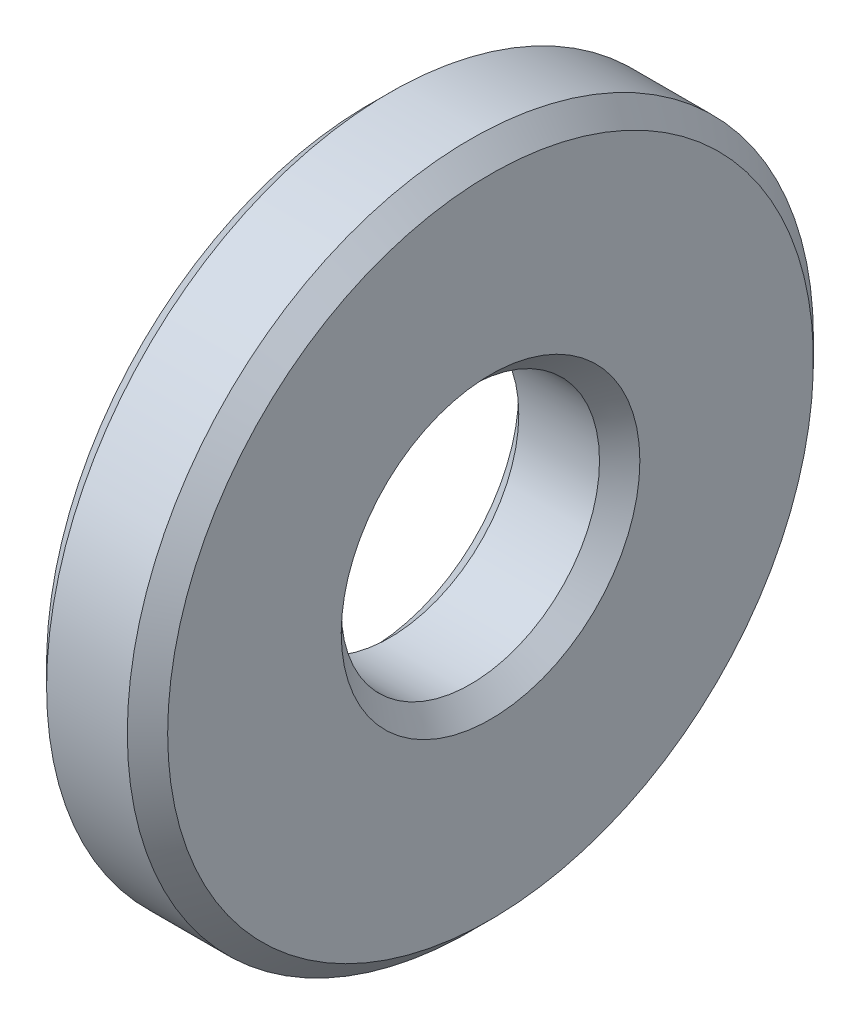
ISO-10303-21;
HEADER;
FILE_DESCRIPTION(('STEP AP214'),'2;1');
FILE_NAME('part.step','',(''),(''),'','','');
FILE_SCHEMA(('AUTOMOTIVE_DESIGN { 1 0 10303 214 1 1 1 1 }'));
ENDSEC;
DATA;
#1=APPLICATION_CONTEXT('core data for automotive mechanical design processes');
#2=APPLICATION_PROTOCOL_DEFINITION('international standard','automotive_design',2000,#1);
#3=PRODUCT_CONTEXT('',#1,'mechanical');
#4=PRODUCT('Part','Part','',(#3));
#5=PRODUCT_RELATED_PRODUCT_CATEGORY('part','',(#4));
#6=PRODUCT_DEFINITION_FORMATION('','',#4);
#7=PRODUCT_DEFINITION_CONTEXT('part definition',#1,'design');
#8=PRODUCT_DEFINITION('design','',#6,#7);
#9=PRODUCT_DEFINITION_SHAPE('','',#8);
#10=(LENGTH_UNIT() NAMED_UNIT(*) SI_UNIT(.MILLI.,.METRE.));
#11=(NAMED_UNIT(*) PLANE_ANGLE_UNIT() SI_UNIT($,.RADIAN.));
#12=(NAMED_UNIT(*) SI_UNIT($,.STERADIAN.) SOLID_ANGLE_UNIT());
#13=UNCERTAINTY_MEASURE_WITH_UNIT(LENGTH_MEASURE(1.E-05),#10,'distance_accuracy_value','');
#14=(GEOMETRIC_REPRESENTATION_CONTEXT(3) GLOBAL_UNCERTAINTY_ASSIGNED_CONTEXT((#13)) GLOBAL_UNIT_ASSIGNED_CONTEXT((#10,
#11,#12)) REPRESENTATION_CONTEXT('',''));
#15=CARTESIAN_POINT('',(0.,0.,0.));
#16=DIRECTION('',(0.,0.,1.));
#17=DIRECTION('',(1.,0.,0.));
#18=AXIS2_PLACEMENT_3D('',#15,#16,#17);
#19=CARTESIAN_POINT('',(0.,3.2,0.));
#20=DIRECTION('',(1.,0.,0.));
#21=DIRECTION('',(0.,0.,-1.));
#22=AXIS2_PLACEMENT_3D('',#19,#20,#21);
#23=PLANE('',#22);
#24=CARTESIAN_POINT('',(0.,0.,0.));
#25=DIRECTION('',(1.,0.,0.));
#26=DIRECTION('',(0.,0.,-1.));
#27=AXIS2_PLACEMENT_3D('',#24,#25,#26);
#28=CIRCLE('',#27,8.);
#29=CARTESIAN_POINT('',(0.,0.,-8.));
#30=VERTEX_POINT('',#29);
#31=EDGE_CURVE('E40',#30,#30,#28,.F.);
#32=ORIENTED_EDGE('',*,*,#31,.T.);
#33=EDGE_LOOP('',(#32));
#34=FACE_BOUND('',#33,.T.);
#35=CARTESIAN_POINT('',(0.,0.,0.));
#36=DIRECTION('',(1.,0.,0.));
#37=DIRECTION('',(0.,0.,-1.));
#38=AXIS2_PLACEMENT_3D('',#35,#36,#37);
#39=CIRCLE('',#38,3.7);
#40=CARTESIAN_POINT('',(0.,0.,-3.7));
#41=VERTEX_POINT('',#40);
#42=EDGE_CURVE('E44',#41,#41,#39,.T.);
#43=ORIENTED_EDGE('',*,*,#42,.T.);
#44=EDGE_LOOP('',(#43));
#45=FACE_BOUND('',#44,.T.);
#46=ADVANCED_FACE('F30',(#34,#45),#23,.F.);
#47=CARTESIAN_POINT('',(0.,0.,0.));
#48=DIRECTION('',(-1.,0.,0.));
#49=DIRECTION('',(0.,0.,1.));
#50=AXIS2_PLACEMENT_3D('',#47,#48,#49);
#51=CYLINDRICAL_SURFACE('',#50,8.5);
#52=CARTESIAN_POINT('',(2.49999999999999,0.,0.));
#53=DIRECTION('',(-1.,0.,0.));
#54=DIRECTION('',(0.,0.,1.));
#55=AXIS2_PLACEMENT_3D('',#52,#53,#54);
#56=CIRCLE('',#55,8.5);
#57=CARTESIAN_POINT('',(2.49999999999999,0.,8.5));
#58=VERTEX_POINT('',#57);
#59=EDGE_CURVE('E55',#58,#58,#56,.T.);
#60=ORIENTED_EDGE('',*,*,#59,.T.);
#61=EDGE_LOOP('',(#60));
#62=FACE_BOUND('',#61,.T.);
#63=CARTESIAN_POINT('',(0.500000000000009,0.,0.));
#64=DIRECTION('',(1.,0.,0.));
#65=DIRECTION('',(0.,0.,-1.));
#66=AXIS2_PLACEMENT_3D('',#63,#64,#65);
#67=CIRCLE('',#66,8.5);
#68=CARTESIAN_POINT('',(0.500000000000009,0.,-8.5));
#69=VERTEX_POINT('',#68);
#70=EDGE_CURVE('E58',#69,#69,#67,.T.);
#71=ORIENTED_EDGE('',*,*,#70,.T.);
#72=EDGE_LOOP('',(#71));
#73=FACE_BOUND('',#72,.T.);
#74=ADVANCED_FACE('F62',(#62,#73),#51,.T.);
#75=CARTESIAN_POINT('',(3.,3.2,0.));
#76=DIRECTION('',(-1.,0.,0.));
#77=DIRECTION('',(0.,0.,1.));
#78=AXIS2_PLACEMENT_3D('',#75,#76,#77);
#79=PLANE('',#78);
#80=CARTESIAN_POINT('',(3.,0.,0.));
#81=DIRECTION('',(-1.,0.,0.));
#82=DIRECTION('',(0.,0.,1.));
#83=AXIS2_PLACEMENT_3D('',#80,#81,#82);
#84=CIRCLE('',#83,8.);
#85=CARTESIAN_POINT('',(3.,0.,8.));
#86=VERTEX_POINT('',#85);
#87=EDGE_CURVE('E49',#86,#86,#84,.F.);
#88=ORIENTED_EDGE('',*,*,#87,.T.);
#89=EDGE_LOOP('',(#88));
#90=FACE_BOUND('',#89,.T.);
#91=CARTESIAN_POINT('',(3.,0.,0.));
#92=DIRECTION('',(-1.,0.,0.));
#93=DIRECTION('',(0.,0.,1.));
#94=AXIS2_PLACEMENT_3D('',#91,#92,#93);
#95=CIRCLE('',#94,3.7);
#96=CARTESIAN_POINT('',(3.,0.,3.7));
#97=VERTEX_POINT('',#96);
#98=EDGE_CURVE('E52',#97,#97,#95,.T.);
#99=ORIENTED_EDGE('',*,*,#98,.T.);
#100=EDGE_LOOP('',(#99));
#101=FACE_BOUND('',#100,.T.);
#102=ADVANCED_FACE('F92',(#90,#101),#79,.F.);
#103=CARTESIAN_POINT('',(0.,0.,0.));
#104=DIRECTION('',(-1.,0.,0.));
#105=DIRECTION('',(0.,0.,1.));
#106=AXIS2_PLACEMENT_3D('',#103,#104,#105);
#107=CYLINDRICAL_SURFACE('',#106,3.2);
#108=CARTESIAN_POINT('',(2.49999999999999,0.,0.));
#109=DIRECTION('',(-1.,0.,0.));
#110=DIRECTION('',(0.,0.,1.));
#111=AXIS2_PLACEMENT_3D('',#108,#109,#110);
#112=CIRCLE('',#111,3.2);
#113=CARTESIAN_POINT('',(2.49999999999999,0.,3.2));
#114=VERTEX_POINT('',#113);
#115=EDGE_CURVE('E10',#114,#114,#112,.F.);
#116=ORIENTED_EDGE('',*,*,#115,.T.);
#117=EDGE_LOOP('',(#116));
#118=FACE_BOUND('',#117,.T.);
#119=CARTESIAN_POINT('',(0.500000000000009,0.,0.));
#120=DIRECTION('',(1.,0.,0.));
#121=DIRECTION('',(0.,0.,-1.));
#122=AXIS2_PLACEMENT_3D('',#119,#120,#121);
#123=CIRCLE('',#122,3.2);
#124=CARTESIAN_POINT('',(0.500000000000009,0.,-3.2));
#125=VERTEX_POINT('',#124);
#126=EDGE_CURVE('E36',#125,#125,#123,.F.);
#127=ORIENTED_EDGE('',*,*,#126,.T.);
#128=EDGE_LOOP('',(#127));
#129=FACE_BOUND('',#128,.T.);
#130=ADVANCED_FACE('F88',(#118,#129),#107,.F.);
#131=CARTESIAN_POINT('',(2.49999999999999,0.,0.));
#132=DIRECTION('',(-1.,0.,0.));
#133=DIRECTION('',(0.,0.,1.));
#134=AXIS2_PLACEMENT_3D('',#131,#132,#133);
#135=CONICAL_SURFACE('',#134,8.5,0.785398163397444);
#136=ORIENTED_EDGE('',*,*,#87,.F.);
#137=EDGE_LOOP('',(#136));
#138=FACE_BOUND('',#137,.T.);
#139=ORIENTED_EDGE('',*,*,#59,.F.);
#140=EDGE_LOOP('',(#139));
#141=FACE_BOUND('',#140,.T.);
#142=ADVANCED_FACE('F68',(#138,#141),#135,.T.);
#143=CARTESIAN_POINT('',(0.,0.,0.));
#144=DIRECTION('',(1.,0.,0.));
#145=DIRECTION('',(0.,0.,-1.));
#146=AXIS2_PLACEMENT_3D('',#143,#144,#145);
#147=CONICAL_SURFACE('',#146,8.,0.785398163397443);
#148=ORIENTED_EDGE('',*,*,#70,.F.);
#149=EDGE_LOOP('',(#148));
#150=FACE_BOUND('',#149,.T.);
#151=ORIENTED_EDGE('',*,*,#31,.F.);
#152=EDGE_LOOP('',(#151));
#153=FACE_BOUND('',#152,.T.);
#154=ADVANCED_FACE('F64',(#150,#153),#147,.T.);
#155=CARTESIAN_POINT('',(3.,0.,0.));
#156=DIRECTION('',(1.,0.,0.));
#157=DIRECTION('',(0.,0.,-1.));
#158=AXIS2_PLACEMENT_3D('',#155,#156,#157);
#159=CONICAL_SURFACE('',#158,3.7,0.785398163397443);
#160=ORIENTED_EDGE('',*,*,#115,.F.);
#161=EDGE_LOOP('',(#160));
#162=FACE_BOUND('',#161,.T.);
#163=ORIENTED_EDGE('',*,*,#98,.F.);
#164=EDGE_LOOP('',(#163));
#165=FACE_BOUND('',#164,.T.);
#166=ADVANCED_FACE('F67',(#162,#165),#159,.F.);
#167=CARTESIAN_POINT('',(0.500000000000009,0.,0.));
#168=DIRECTION('',(-1.,0.,0.));
#169=DIRECTION('',(0.,0.,1.));
#170=AXIS2_PLACEMENT_3D('',#167,#168,#169);
#171=CONICAL_SURFACE('',#170,3.2,0.785398163397443);
#172=ORIENTED_EDGE('',*,*,#42,.F.);
#173=EDGE_LOOP('',(#172));
#174=FACE_BOUND('',#173,.T.);
#175=ORIENTED_EDGE('',*,*,#126,.F.);
#176=EDGE_LOOP('',(#175));
#177=FACE_BOUND('',#176,.T.);
#178=ADVANCED_FACE('F76',(#174,#177),#171,.F.);
#179=CLOSED_SHELL('',(#46,#74,#102,#130,#142,#154,#166,#178));
#180=MANIFOLD_SOLID_BREP('B2',#179);
#181=ADVANCED_BREP_SHAPE_REPRESENTATION('',(#18,#180),#14);
#182=SHAPE_DEFINITION_REPRESENTATION(#9,#181);
ENDSEC;
END-ISO-10303-21;
